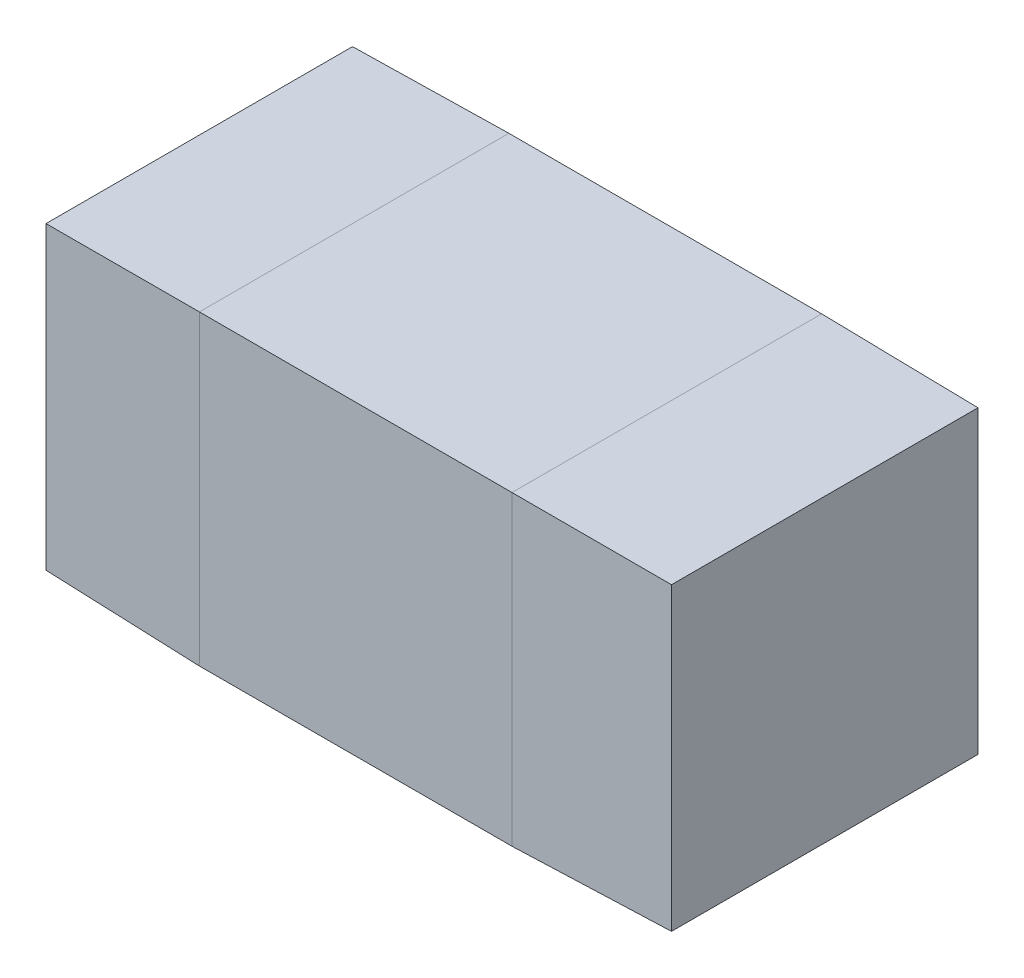
ISO-10303-21;
HEADER;
FILE_DESCRIPTION(('STEP AP214'),'2;1');
FILE_NAME('part.step','',(''),(''),'','','');
FILE_SCHEMA(('AUTOMOTIVE_DESIGN { 1 0 10303 214 1 1 1 1 }'));
ENDSEC;
DATA;
#1=APPLICATION_CONTEXT('core data for automotive mechanical design processes');
#2=APPLICATION_PROTOCOL_DEFINITION('international standard','automotive_design',2000,#1);
#3=PRODUCT_CONTEXT('',#1,'mechanical');
#4=PRODUCT('Part','Part','',(#3));
#5=PRODUCT_RELATED_PRODUCT_CATEGORY('part','',(#4));
#6=PRODUCT_DEFINITION_FORMATION('','',#4);
#7=PRODUCT_DEFINITION_CONTEXT('part definition',#1,'design');
#8=PRODUCT_DEFINITION('design','',#6,#7);
#9=PRODUCT_DEFINITION_SHAPE('','',#8);
#10=(LENGTH_UNIT() NAMED_UNIT(*) SI_UNIT(.MILLI.,.METRE.));
#11=(NAMED_UNIT(*) PLANE_ANGLE_UNIT() SI_UNIT($,.RADIAN.));
#12=(NAMED_UNIT(*) SI_UNIT($,.STERADIAN.) SOLID_ANGLE_UNIT());
#13=UNCERTAINTY_MEASURE_WITH_UNIT(LENGTH_MEASURE(1.E-05),#10,'distance_accuracy_value','');
#14=(GEOMETRIC_REPRESENTATION_CONTEXT(3) GLOBAL_UNCERTAINTY_ASSIGNED_CONTEXT((#13)) GLOBAL_UNIT_ASSIGNED_CONTEXT((#10,
#11,#12)) REPRESENTATION_CONTEXT('',''));
#15=CARTESIAN_POINT('',(0.,0.,0.));
#16=DIRECTION('',(0.,0.,1.));
#17=DIRECTION('',(1.,0.,0.));
#18=AXIS2_PLACEMENT_3D('',#15,#16,#17);
#19=CARTESIAN_POINT('',(0.,0.,0.49));
#20=DIRECTION('',(0.,0.,-1.));
#21=DIRECTION('',(-1.,0.,0.));
#22=AXIS2_PLACEMENT_3D('',#19,#20,#21);
#23=PLANE('',#22);
#24=CARTESIAN_POINT('',(-0.5,0.24,0.49));
#25=DIRECTION('',(0.9999000149975,0.,0.0141407216222653));
#26=VECTOR('',#25,1.);
#27=LINE('',#24,#26);
#28=CARTESIAN_POINT('',(-0.5,0.24,0.49));
#29=VERTEX_POINT('',#28);
#30=CARTESIAN_POINT('',(-0.25,0.245000108849644,0.494670613901245));
#31=VERTEX_POINT('',#30);
#32=EDGE_CURVE('E102',#29,#31,#27,.T.);
#33=ORIENTED_EDGE('',*,*,#32,.F.);
#34=DIRECTION('',(0.,-1.,0.));
#35=VECTOR('',#34,1.);
#36=CARTESIAN_POINT('',(-0.5,0.24,0.49));
#37=LINE('',#36,#35);
#38=CARTESIAN_POINT('',(-0.5,-0.24,0.49));
#39=VERTEX_POINT('',#38);
#40=EDGE_CURVE('E145',#39,#29,#37,.F.);
#41=ORIENTED_EDGE('',*,*,#40,.F.);
#42=CARTESIAN_POINT('',(-0.25,-0.24,0.495));
#43=DIRECTION('',(-0.999800059980007,0.,-0.0199960011996002));
#44=VECTOR('',#43,1.);
#45=LINE('',#42,#44);
#46=CARTESIAN_POINT('',(-0.25,-0.245,0.495));
#47=VERTEX_POINT('',#46);
#48=EDGE_CURVE('E144',#47,#39,#45,.T.);
#49=ORIENTED_EDGE('',*,*,#48,.F.);
#50=CARTESIAN_POINT('',(-0.25,0.243535533905933,0.5));
#51=DIRECTION('',(0.,-1.,0.));
#52=VECTOR('',#51,1.);
#53=LINE('',#50,#52);
#54=EDGE_CURVE('E213',#31,#47,#53,.T.);
#55=ORIENTED_EDGE('',*,*,#54,.F.);
#56=EDGE_LOOP('',(#33,#41,#49,#55));
#57=FACE_BOUND('',#56,.T.);
#58=ADVANCED_FACE('F16',(#57),#23,.F.);
#59=CARTESIAN_POINT('',(0.,0.,0.49));
#60=DIRECTION('',(0.,0.,1.));
#61=DIRECTION('',(1.,0.,0.));
#62=AXIS2_PLACEMENT_3D('',#59,#60,#61);
#63=PLANE('',#62);
#64=DIRECTION('',(0.,1.,0.));
#65=VECTOR('',#64,1.);
#66=CARTESIAN_POINT('',(0.5,0.24,0.49));
#67=LINE('',#66,#65);
#68=CARTESIAN_POINT('',(0.5,0.24,0.49));
#69=VERTEX_POINT('',#68);
#70=CARTESIAN_POINT('',(0.5,-0.24,0.49));
#71=VERTEX_POINT('',#70);
#72=EDGE_CURVE('E157',#69,#71,#67,.F.);
#73=ORIENTED_EDGE('',*,*,#72,.F.);
#74=CARTESIAN_POINT('',(0.25,0.24,0.495));
#75=DIRECTION('',(0.999800059980007,0.,-0.0199960011996002));
#76=VECTOR('',#75,1.);
#77=LINE('',#74,#76);
#78=CARTESIAN_POINT('',(0.25,0.245116219989509,0.495000683142964));
#79=VERTEX_POINT('',#78);
#80=EDGE_CURVE('E156',#79,#69,#77,.T.);
#81=ORIENTED_EDGE('',*,*,#80,.F.);
#82=CARTESIAN_POINT('',(0.25,-0.243535533905933,0.5));
#83=DIRECTION('',(0.,1.,0.));
#84=VECTOR('',#83,1.);
#85=LINE('',#82,#84);
#86=CARTESIAN_POINT('',(0.25,-0.245000108849644,0.494670613901245));
#87=VERTEX_POINT('',#86);
#88=EDGE_CURVE('E272',#87,#79,#85,.T.);
#89=ORIENTED_EDGE('',*,*,#88,.F.);
#90=CARTESIAN_POINT('',(0.5,-0.24,0.49));
#91=DIRECTION('',(-0.9999000149975,0.,0.0141407216222653));
#92=VECTOR('',#91,1.);
#93=LINE('',#90,#92);
#94=EDGE_CURVE('E176',#71,#87,#93,.T.);
#95=ORIENTED_EDGE('',*,*,#94,.F.);
#96=EDGE_LOOP('',(#73,#81,#89,#95));
#97=FACE_BOUND('',#96,.T.);
#98=ADVANCED_FACE('F174',(#97),#63,.T.);
#99=CARTESIAN_POINT('',(0.,0.,0.5));
#100=DIRECTION('',(0.,0.,1.));
#101=DIRECTION('',(1.,0.,0.));
#102=AXIS2_PLACEMENT_3D('',#99,#100,#101);
#103=PLANE('',#102);
#104=ORIENTED_EDGE('',*,*,#54,.T.);
#105=CARTESIAN_POINT('',(-0.25,-0.25,0.5));
#106=DIRECTION('',(1.,0.,0.));
#107=VECTOR('',#106,1.);
#108=LINE('',#105,#107);
#109=EDGE_CURVE('E275',#47,#87,#108,.T.);
#110=ORIENTED_EDGE('',*,*,#109,.T.);
#111=ORIENTED_EDGE('',*,*,#88,.T.);
#112=CARTESIAN_POINT('',(0.25,0.25,0.5));
#113=DIRECTION('',(-1.,0.,0.));
#114=VECTOR('',#113,1.);
#115=LINE('',#112,#114);
#116=EDGE_CURVE('E107',#79,#31,#115,.T.);
#117=ORIENTED_EDGE('',*,*,#116,.T.);
#118=EDGE_LOOP('',(#104,#110,#111,#117));
#119=FACE_BOUND('',#118,.T.);
#120=ADVANCED_FACE('F243',(#119),#103,.T.);
#121=CARTESIAN_POINT('',(-0.25,0.24,0.49));
#122=DIRECTION('',(0.,1.,0.));
#123=DIRECTION('',(0.,0.,1.));
#124=AXIS2_PLACEMENT_3D('',#121,#122,#123);
#125=PLANE('',#124);
#126=ORIENTED_EDGE('',*,*,#32,.T.);
#127=CARTESIAN_POINT('',(-0.25,0.24,0.493535533905933));
#128=DIRECTION('',(0.,0.,-1.));
#129=VECTOR('',#128,1.);
#130=LINE('',#127,#129);
#131=CARTESIAN_POINT('',(-0.25,0.245,0.));
#132=VERTEX_POINT('',#131);
#133=EDGE_CURVE('E97',#31,#132,#130,.T.);
#134=ORIENTED_EDGE('',*,*,#133,.T.);
#135=DIRECTION('',(1.,0.,0.));
#136=VECTOR('',#135,1.);
#137=CARTESIAN_POINT('',(-0.25,0.24,0.));
#138=LINE('',#137,#136);
#139=CARTESIAN_POINT('',(-0.5,0.24,0.));
#140=VERTEX_POINT('',#139);
#141=EDGE_CURVE('E90',#132,#140,#138,.F.);
#142=ORIENTED_EDGE('',*,*,#141,.T.);
#143=DIRECTION('',(0.,0.,1.));
#144=VECTOR('',#143,1.);
#145=CARTESIAN_POINT('',(-0.5,0.24,0.49));
#146=LINE('',#145,#144);
#147=EDGE_CURVE('E85',#29,#140,#146,.F.);
#148=ORIENTED_EDGE('',*,*,#147,.F.);
#149=EDGE_LOOP('',(#126,#134,#142,#148));
#150=FACE_BOUND('',#149,.T.);
#151=ADVANCED_FACE('F100',(#150),#125,.T.);
#152=CARTESIAN_POINT('',(-0.5,0.24,0.49));
#153=DIRECTION('',(-1.,0.,0.));
#154=DIRECTION('',(0.,-1.,0.));
#155=AXIS2_PLACEMENT_3D('',#152,#153,#154);
#156=PLANE('',#155);
#157=ORIENTED_EDGE('',*,*,#40,.T.);
#158=ORIENTED_EDGE('',*,*,#147,.T.);
#159=DIRECTION('',(0.,1.,0.));
#160=VECTOR('',#159,1.);
#161=CARTESIAN_POINT('',(-0.5,0.,0.));
#162=LINE('',#161,#160);
#163=CARTESIAN_POINT('',(-0.5,-0.24,0.));
#164=VERTEX_POINT('',#163);
#165=EDGE_CURVE('E95',#140,#164,#162,.F.);
#166=ORIENTED_EDGE('',*,*,#165,.T.);
#167=DIRECTION('',(0.,0.,1.));
#168=VECTOR('',#167,1.);
#169=CARTESIAN_POINT('',(-0.5,-0.24,0.49));
#170=LINE('',#169,#168);
#171=EDGE_CURVE('E79',#39,#164,#170,.F.);
#172=ORIENTED_EDGE('',*,*,#171,.F.);
#173=EDGE_LOOP('',(#157,#158,#166,#172));
#174=FACE_BOUND('',#173,.T.);
#175=ADVANCED_FACE('F207',(#174),#156,.T.);
#176=CARTESIAN_POINT('',(-0.25,-0.24,0.49));
#177=DIRECTION('',(0.,-1.,0.));
#178=DIRECTION('',(1.,0.,0.));
#179=AXIS2_PLACEMENT_3D('',#176,#177,#178);
#180=PLANE('',#179);
#181=ORIENTED_EDGE('',*,*,#48,.T.);
#182=ORIENTED_EDGE('',*,*,#171,.T.);
#183=DIRECTION('',(1.,0.,0.));
#184=VECTOR('',#183,1.);
#185=CARTESIAN_POINT('',(-0.25,-0.24,0.));
#186=LINE('',#185,#184);
#187=CARTESIAN_POINT('',(-0.25,-0.245,0.));
#188=VERTEX_POINT('',#187);
#189=EDGE_CURVE('E147',#164,#188,#186,.T.);
#190=ORIENTED_EDGE('',*,*,#189,.T.);
#191=CARTESIAN_POINT('',(-0.25,-0.24,0.));
#192=DIRECTION('',(0.,0.,1.));
#193=VECTOR('',#192,1.);
#194=LINE('',#191,#193);
#195=EDGE_CURVE('E151',#188,#47,#194,.T.);
#196=ORIENTED_EDGE('',*,*,#195,.T.);
#197=EDGE_LOOP('',(#181,#182,#190,#196));
#198=FACE_BOUND('',#197,.T.);
#199=ADVANCED_FACE('F205',(#198),#180,.T.);
#200=CARTESIAN_POINT('',(-0.25,-0.25,0.5));
#201=DIRECTION('',(0.,1.,0.));
#202=DIRECTION('',(0.,0.,1.));
#203=AXIS2_PLACEMENT_3D('',#200,#201,#202);
#204=PLANE('',#203);
#205=CARTESIAN_POINT('',(0.25,-0.24,0.493535533905933));
#206=DIRECTION('',(0.,0.,-1.));
#207=VECTOR('',#206,1.);
#208=LINE('',#205,#207);
#209=CARTESIAN_POINT('',(0.25,-0.245,0.));
#210=VERTEX_POINT('',#209);
#211=EDGE_CURVE('E180',#87,#210,#208,.T.);
#212=ORIENTED_EDGE('',*,*,#211,.F.);
#213=ORIENTED_EDGE('',*,*,#109,.F.);
#214=ORIENTED_EDGE('',*,*,#195,.F.);
#215=DIRECTION('',(1.,0.,0.));
#216=VECTOR('',#215,1.);
#217=CARTESIAN_POINT('',(-0.25,-0.25,0.));
#218=LINE('',#217,#216);
#219=EDGE_CURVE('E191',#188,#210,#218,.T.);
#220=ORIENTED_EDGE('',*,*,#219,.T.);
#221=EDGE_LOOP('',(#212,#213,#214,#220));
#222=FACE_BOUND('',#221,.T.);
#223=ADVANCED_FACE('F328',(#222),#204,.F.);
#224=CARTESIAN_POINT('',(0.25,-0.24,0.49));
#225=DIRECTION('',(0.,-1.,0.));
#226=DIRECTION('',(1.,0.,0.));
#227=AXIS2_PLACEMENT_3D('',#224,#225,#226);
#228=PLANE('',#227);
#229=ORIENTED_EDGE('',*,*,#94,.T.);
#230=ORIENTED_EDGE('',*,*,#211,.T.);
#231=DIRECTION('',(1.,0.,0.));
#232=VECTOR('',#231,1.);
#233=CARTESIAN_POINT('',(0.25,-0.24,0.));
#234=LINE('',#233,#232);
#235=CARTESIAN_POINT('',(0.5,-0.24,0.));
#236=VERTEX_POINT('',#235);
#237=EDGE_CURVE('E161',#210,#236,#234,.T.);
#238=ORIENTED_EDGE('',*,*,#237,.T.);
#239=DIRECTION('',(0.,0.,1.));
#240=VECTOR('',#239,1.);
#241=CARTESIAN_POINT('',(0.5,-0.24,0.49));
#242=LINE('',#241,#240);
#243=EDGE_CURVE('E154',#71,#236,#242,.F.);
#244=ORIENTED_EDGE('',*,*,#243,.F.);
#245=EDGE_LOOP('',(#229,#230,#238,#244));
#246=FACE_BOUND('',#245,.T.);
#247=ADVANCED_FACE('F188',(#246),#228,.T.);
#248=CARTESIAN_POINT('',(0.5,0.24,0.49));
#249=DIRECTION('',(1.,0.,0.));
#250=DIRECTION('',(0.,1.,0.));
#251=AXIS2_PLACEMENT_3D('',#248,#249,#250);
#252=PLANE('',#251);
#253=ORIENTED_EDGE('',*,*,#72,.T.);
#254=ORIENTED_EDGE('',*,*,#243,.T.);
#255=DIRECTION('',(0.,1.,0.));
#256=VECTOR('',#255,1.);
#257=CARTESIAN_POINT('',(0.5,0.,0.));
#258=LINE('',#257,#256);
#259=CARTESIAN_POINT('',(0.5,0.24,0.));
#260=VERTEX_POINT('',#259);
#261=EDGE_CURVE('E158',#236,#260,#258,.T.);
#262=ORIENTED_EDGE('',*,*,#261,.T.);
#263=DIRECTION('',(0.,0.,1.));
#264=VECTOR('',#263,1.);
#265=CARTESIAN_POINT('',(0.5,0.24,0.49));
#266=LINE('',#265,#264);
#267=EDGE_CURVE('E164',#69,#260,#266,.F.);
#268=ORIENTED_EDGE('',*,*,#267,.F.);
#269=EDGE_LOOP('',(#253,#254,#262,#268));
#270=FACE_BOUND('',#269,.T.);
#271=ADVANCED_FACE('F120',(#270),#252,.T.);
#272=CARTESIAN_POINT('',(0.25,0.24,0.49));
#273=DIRECTION('',(0.,1.,0.));
#274=DIRECTION('',(-1.,0.,0.));
#275=AXIS2_PLACEMENT_3D('',#272,#273,#274);
#276=PLANE('',#275);
#277=ORIENTED_EDGE('',*,*,#80,.T.);
#278=ORIENTED_EDGE('',*,*,#267,.T.);
#279=DIRECTION('',(-1.,0.,0.));
#280=VECTOR('',#279,1.);
#281=CARTESIAN_POINT('',(0.25,0.24,0.));
#282=LINE('',#281,#280);
#283=CARTESIAN_POINT('',(0.25,0.244999999999999,0.));
#284=VERTEX_POINT('',#283);
#285=EDGE_CURVE('E26',#260,#284,#282,.T.);
#286=ORIENTED_EDGE('',*,*,#285,.T.);
#287=CARTESIAN_POINT('',(0.25,0.24,0.));
#288=DIRECTION('',(0.,0.,1.));
#289=VECTOR('',#288,1.);
#290=LINE('',#287,#289);
#291=EDGE_CURVE('E34',#284,#79,#290,.T.);
#292=ORIENTED_EDGE('',*,*,#291,.T.);
#293=EDGE_LOOP('',(#277,#278,#286,#292));
#294=FACE_BOUND('',#293,.T.);
#295=ADVANCED_FACE('F112',(#294),#276,.T.);
#296=CARTESIAN_POINT('',(-0.25,0.25,0.5));
#297=DIRECTION('',(0.,-1.,0.));
#298=DIRECTION('',(0.,0.,-1.));
#299=AXIS2_PLACEMENT_3D('',#296,#297,#298);
#300=PLANE('',#299);
#301=ORIENTED_EDGE('',*,*,#133,.F.);
#302=ORIENTED_EDGE('',*,*,#116,.F.);
#303=ORIENTED_EDGE('',*,*,#291,.F.);
#304=DIRECTION('',(1.,0.,0.));
#305=VECTOR('',#304,1.);
#306=CARTESIAN_POINT('',(-0.25,0.25,0.));
#307=LINE('',#306,#305);
#308=EDGE_CURVE('E11',#284,#132,#307,.F.);
#309=ORIENTED_EDGE('',*,*,#308,.T.);
#310=EDGE_LOOP('',(#301,#302,#303,#309));
#311=FACE_BOUND('',#310,.T.);
#312=ADVANCED_FACE('F110',(#311),#300,.F.);
#313=CARTESIAN_POINT('',(0.,0.,0.));
#314=DIRECTION('',(0.,0.,1.));
#315=DIRECTION('',(1.,0.,0.));
#316=AXIS2_PLACEMENT_3D('',#313,#314,#315);
#317=PLANE('',#316);
#318=ORIENTED_EDGE('',*,*,#285,.F.);
#319=ORIENTED_EDGE('',*,*,#261,.F.);
#320=ORIENTED_EDGE('',*,*,#237,.F.);
#321=ORIENTED_EDGE('',*,*,#219,.F.);
#322=ORIENTED_EDGE('',*,*,#189,.F.);
#323=ORIENTED_EDGE('',*,*,#165,.F.);
#324=ORIENTED_EDGE('',*,*,#141,.F.);
#325=ORIENTED_EDGE('',*,*,#308,.F.);
#326=EDGE_LOOP('',(#318,#319,#320,#321,#322,#323,#324,#325));
#327=FACE_BOUND('',#326,.T.);
#328=ADVANCED_FACE('F93',(#327),#317,.F.);
#329=CLOSED_SHELL('',(#58,#98,#120,#151,#175,#199,#223,#247,#271,#295,#312,#328));
#330=MANIFOLD_SOLID_BREP('B1',#329);
#331=ADVANCED_BREP_SHAPE_REPRESENTATION('',(#18,#330),#14);
#332=SHAPE_DEFINITION_REPRESENTATION(#9,#331);
ENDSEC;
END-ISO-10303-21;
